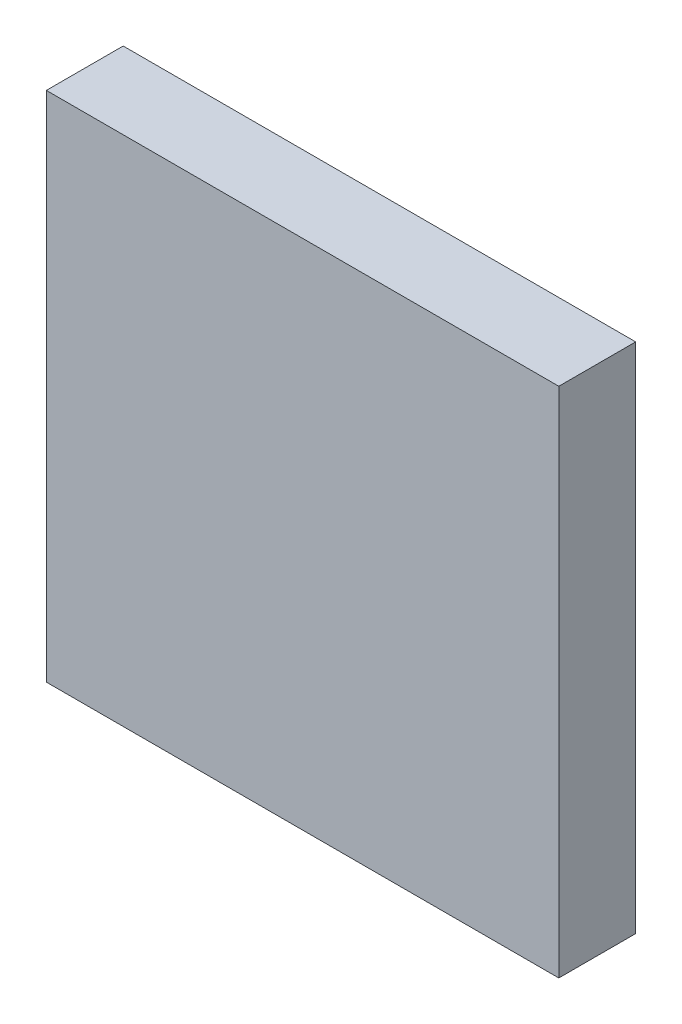
ISO-10303-21;
HEADER;
FILE_DESCRIPTION(('STEP AP214'),'2;1');
FILE_NAME('part.step','',(''),(''),'','','');
FILE_SCHEMA(('AUTOMOTIVE_DESIGN { 1 0 10303 214 1 1 1 1 }'));
ENDSEC;
DATA;
#1=APPLICATION_CONTEXT('core data for automotive mechanical design processes');
#2=APPLICATION_PROTOCOL_DEFINITION('international standard','automotive_design',2000,#1);
#3=PRODUCT_CONTEXT('',#1,'mechanical');
#4=PRODUCT('Part','Part','',(#3));
#5=PRODUCT_RELATED_PRODUCT_CATEGORY('part','',(#4));
#6=PRODUCT_DEFINITION_FORMATION('','',#4);
#7=PRODUCT_DEFINITION_CONTEXT('part definition',#1,'design');
#8=PRODUCT_DEFINITION('design','',#6,#7);
#9=PRODUCT_DEFINITION_SHAPE('','',#8);
#10=(LENGTH_UNIT() NAMED_UNIT(*) SI_UNIT(.MILLI.,.METRE.));
#11=(NAMED_UNIT(*) PLANE_ANGLE_UNIT() SI_UNIT($,.RADIAN.));
#12=(NAMED_UNIT(*) SI_UNIT($,.STERADIAN.) SOLID_ANGLE_UNIT());
#13=UNCERTAINTY_MEASURE_WITH_UNIT(LENGTH_MEASURE(1.E-05),#10,'distance_accuracy_value','');
#14=(GEOMETRIC_REPRESENTATION_CONTEXT(3) GLOBAL_UNCERTAINTY_ASSIGNED_CONTEXT((#13)) GLOBAL_UNIT_ASSIGNED_CONTEXT((#10,
#11,#12)) REPRESENTATION_CONTEXT('',''));
#15=CARTESIAN_POINT('',(0.,0.,0.));
#16=DIRECTION('',(0.,0.,1.));
#17=DIRECTION('',(1.,0.,0.));
#18=AXIS2_PLACEMENT_3D('',#15,#16,#17);
#19=CARTESIAN_POINT('',(0.,0.,15.));
#20=DIRECTION('',(1.,0.,0.));
#21=DIRECTION('',(0.,0.,-1.));
#22=AXIS2_PLACEMENT_3D('',#19,#20,#21);
#23=PLANE('',#22);
#24=DIRECTION('',(0.,-1.,0.));
#25=VECTOR('',#24,1.);
#26=CARTESIAN_POINT('',(0.,0.,0.));
#27=LINE('',#26,#25);
#28=CARTESIAN_POINT('',(0.,100.,0.));
#29=VERTEX_POINT('',#28);
#30=CARTESIAN_POINT('',(0.,0.,0.));
#31=VERTEX_POINT('',#30);
#32=EDGE_CURVE('E96',#29,#31,#27,.T.);
#33=ORIENTED_EDGE('',*,*,#32,.T.);
#34=DIRECTION('',(0.,0.,-1.));
#35=VECTOR('',#34,1.);
#36=CARTESIAN_POINT('',(0.,0.,15.));
#37=LINE('',#36,#35);
#38=CARTESIAN_POINT('',(0.,0.,15.));
#39=VERTEX_POINT('',#38);
#40=EDGE_CURVE('E11',#39,#31,#37,.T.);
#41=ORIENTED_EDGE('',*,*,#40,.F.);
#42=DIRECTION('',(0.,-1.,0.));
#43=VECTOR('',#42,1.);
#44=CARTESIAN_POINT('',(0.,0.,15.));
#45=LINE('',#44,#43);
#46=CARTESIAN_POINT('',(0.,100.,15.));
#47=VERTEX_POINT('',#46);
#48=EDGE_CURVE('E84',#47,#39,#45,.T.);
#49=ORIENTED_EDGE('',*,*,#48,.F.);
#50=DIRECTION('',(0.,0.,-1.));
#51=VECTOR('',#50,1.);
#52=CARTESIAN_POINT('',(0.,100.,15.));
#53=LINE('',#52,#51);
#54=EDGE_CURVE('E92',#47,#29,#53,.T.);
#55=ORIENTED_EDGE('',*,*,#54,.T.);
#56=EDGE_LOOP('',(#33,#41,#49,#55));
#57=FACE_BOUND('',#56,.T.);
#58=ADVANCED_FACE('F33',(#57),#23,.F.);
#59=CARTESIAN_POINT('',(0.,0.,15.));
#60=DIRECTION('',(0.,1.,0.));
#61=DIRECTION('',(0.,0.,1.));
#62=AXIS2_PLACEMENT_3D('',#59,#60,#61);
#63=PLANE('',#62);
#64=DIRECTION('',(1.,0.,0.));
#65=VECTOR('',#64,1.);
#66=CARTESIAN_POINT('',(0.,0.,0.));
#67=LINE('',#66,#65);
#68=CARTESIAN_POINT('',(100.,0.,0.));
#69=VERTEX_POINT('',#68);
#70=EDGE_CURVE('E88',#31,#69,#67,.T.);
#71=ORIENTED_EDGE('',*,*,#70,.T.);
#72=DIRECTION('',(0.,0.,-1.));
#73=VECTOR('',#72,1.);
#74=CARTESIAN_POINT('',(100.,0.,15.));
#75=LINE('',#74,#73);
#76=CARTESIAN_POINT('',(100.,0.,15.));
#77=VERTEX_POINT('',#76);
#78=EDGE_CURVE('E41',#77,#69,#75,.T.);
#79=ORIENTED_EDGE('',*,*,#78,.F.);
#80=DIRECTION('',(1.,0.,0.));
#81=VECTOR('',#80,1.);
#82=CARTESIAN_POINT('',(0.,0.,15.));
#83=LINE('',#82,#81);
#84=EDGE_CURVE('E79',#39,#77,#83,.T.);
#85=ORIENTED_EDGE('',*,*,#84,.F.);
#86=ORIENTED_EDGE('',*,*,#40,.T.);
#87=EDGE_LOOP('',(#71,#79,#85,#86));
#88=FACE_BOUND('',#87,.T.);
#89=ADVANCED_FACE('F87',(#88),#63,.F.);
#90=CARTESIAN_POINT('',(100.,0.,15.));
#91=DIRECTION('',(-1.,0.,0.));
#92=DIRECTION('',(0.,0.,1.));
#93=AXIS2_PLACEMENT_3D('',#90,#91,#92);
#94=PLANE('',#93);
#95=DIRECTION('',(0.,1.,0.));
#96=VECTOR('',#95,1.);
#97=CARTESIAN_POINT('',(100.,0.,0.));
#98=LINE('',#97,#96);
#99=CARTESIAN_POINT('',(100.,100.,0.));
#100=VERTEX_POINT('',#99);
#101=EDGE_CURVE('E66',#69,#100,#98,.T.);
#102=ORIENTED_EDGE('',*,*,#101,.T.);
#103=DIRECTION('',(0.,0.,-1.));
#104=VECTOR('',#103,1.);
#105=CARTESIAN_POINT('',(100.,100.,15.));
#106=LINE('',#105,#104);
#107=CARTESIAN_POINT('',(100.,100.,15.));
#108=VERTEX_POINT('',#107);
#109=EDGE_CURVE('E89',#108,#100,#106,.T.);
#110=ORIENTED_EDGE('',*,*,#109,.F.);
#111=DIRECTION('',(0.,1.,0.));
#112=VECTOR('',#111,1.);
#113=CARTESIAN_POINT('',(100.,0.,15.));
#114=LINE('',#113,#112);
#115=EDGE_CURVE('E82',#77,#108,#114,.T.);
#116=ORIENTED_EDGE('',*,*,#115,.F.);
#117=ORIENTED_EDGE('',*,*,#78,.T.);
#118=EDGE_LOOP('',(#102,#110,#116,#117));
#119=FACE_BOUND('',#118,.T.);
#120=ADVANCED_FACE('F90',(#119),#94,.F.);
#121=CARTESIAN_POINT('',(0.,100.,15.));
#122=DIRECTION('',(0.,-1.,0.));
#123=DIRECTION('',(0.,0.,-1.));
#124=AXIS2_PLACEMENT_3D('',#121,#122,#123);
#125=PLANE('',#124);
#126=DIRECTION('',(-1.,0.,0.));
#127=VECTOR('',#126,1.);
#128=CARTESIAN_POINT('',(0.,100.,0.));
#129=LINE('',#128,#127);
#130=EDGE_CURVE('E72',#100,#29,#129,.T.);
#131=ORIENTED_EDGE('',*,*,#130,.T.);
#132=ORIENTED_EDGE('',*,*,#54,.F.);
#133=DIRECTION('',(-1.,0.,0.));
#134=VECTOR('',#133,1.);
#135=CARTESIAN_POINT('',(0.,100.,15.));
#136=LINE('',#135,#134);
#137=EDGE_CURVE('E49',#108,#47,#136,.T.);
#138=ORIENTED_EDGE('',*,*,#137,.F.);
#139=ORIENTED_EDGE('',*,*,#109,.T.);
#140=EDGE_LOOP('',(#131,#132,#138,#139));
#141=FACE_BOUND('',#140,.T.);
#142=ADVANCED_FACE('F103',(#141),#125,.F.);
#143=CARTESIAN_POINT('',(0.,0.,15.));
#144=DIRECTION('',(0.,0.,-1.));
#145=DIRECTION('',(-1.,0.,0.));
#146=AXIS2_PLACEMENT_3D('',#143,#144,#145);
#147=PLANE('',#146);
#148=ORIENTED_EDGE('',*,*,#48,.T.);
#149=ORIENTED_EDGE('',*,*,#84,.T.);
#150=ORIENTED_EDGE('',*,*,#115,.T.);
#151=ORIENTED_EDGE('',*,*,#137,.T.);
#152=EDGE_LOOP('',(#148,#149,#150,#151));
#153=FACE_BOUND('',#152,.T.);
#154=ADVANCED_FACE('F80',(#153),#147,.F.);
#155=CARTESIAN_POINT('',(0.,0.,0.));
#156=DIRECTION('',(0.,0.,-1.));
#157=DIRECTION('',(-1.,0.,0.));
#158=AXIS2_PLACEMENT_3D('',#155,#156,#157);
#159=PLANE('',#158);
#160=ORIENTED_EDGE('',*,*,#32,.F.);
#161=ORIENTED_EDGE('',*,*,#130,.F.);
#162=ORIENTED_EDGE('',*,*,#101,.F.);
#163=ORIENTED_EDGE('',*,*,#70,.F.);
#164=EDGE_LOOP('',(#160,#161,#162,#163));
#165=FACE_BOUND('',#164,.T.);
#166=ADVANCED_FACE('F106',(#165),#159,.T.);
#167=CLOSED_SHELL('',(#58,#89,#120,#142,#154,#166));
#168=MANIFOLD_SOLID_BREP('B2',#167);
#169=ADVANCED_BREP_SHAPE_REPRESENTATION('',(#18,#168),#14);
#170=SHAPE_DEFINITION_REPRESENTATION(#9,#169);
ENDSEC;
END-ISO-10303-21;
